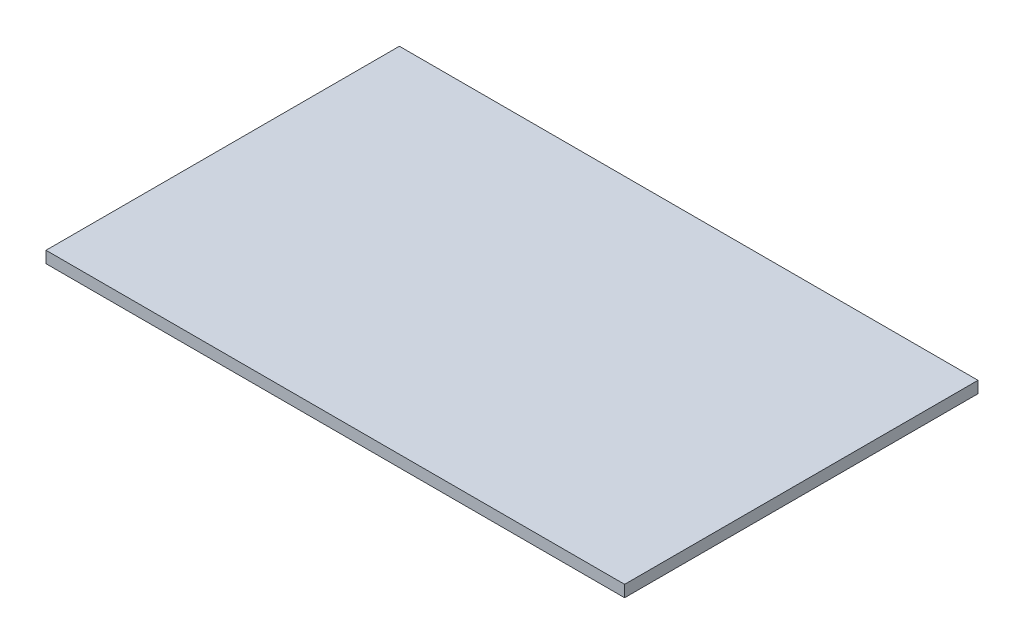
ISO-10303-21;
HEADER;
FILE_DESCRIPTION(('STEP AP214'),'2;1');
FILE_NAME('part.step','',(''),(''),'','','');
FILE_SCHEMA(('AUTOMOTIVE_DESIGN { 1 0 10303 214 1 1 1 1 }'));
ENDSEC;
DATA;
#1=APPLICATION_CONTEXT('core data for automotive mechanical design processes');
#2=APPLICATION_PROTOCOL_DEFINITION('international standard','automotive_design',2000,#1);
#3=PRODUCT_CONTEXT('',#1,'mechanical');
#4=PRODUCT('Part','Part','',(#3));
#5=PRODUCT_RELATED_PRODUCT_CATEGORY('part','',(#4));
#6=PRODUCT_DEFINITION_FORMATION('','',#4);
#7=PRODUCT_DEFINITION_CONTEXT('part definition',#1,'design');
#8=PRODUCT_DEFINITION('design','',#6,#7);
#9=PRODUCT_DEFINITION_SHAPE('','',#8);
#10=(LENGTH_UNIT() NAMED_UNIT(*) SI_UNIT(.MILLI.,.METRE.));
#11=(NAMED_UNIT(*) PLANE_ANGLE_UNIT() SI_UNIT($,.RADIAN.));
#12=(NAMED_UNIT(*) SI_UNIT($,.STERADIAN.) SOLID_ANGLE_UNIT());
#13=UNCERTAINTY_MEASURE_WITH_UNIT(LENGTH_MEASURE(1.E-05),#10,'distance_accuracy_value','');
#14=(GEOMETRIC_REPRESENTATION_CONTEXT(3) GLOBAL_UNCERTAINTY_ASSIGNED_CONTEXT((#13)) GLOBAL_UNIT_ASSIGNED_CONTEXT((#10,
#11,#12)) REPRESENTATION_CONTEXT('',''));
#15=CARTESIAN_POINT('',(0.,0.,0.));
#16=DIRECTION('',(0.,0.,1.));
#17=DIRECTION('',(1.,0.,0.));
#18=AXIS2_PLACEMENT_3D('',#15,#16,#17);
#19=CARTESIAN_POINT('',(0.,19.05,0.));
#20=DIRECTION('',(1.,0.,0.));
#21=DIRECTION('',(0.,0.,-1.));
#22=AXIS2_PLACEMENT_3D('',#19,#20,#21);
#23=PLANE('',#22);
#24=DIRECTION('',(0.,0.,1.));
#25=VECTOR('',#24,1.);
#26=CARTESIAN_POINT('',(0.,0.,0.));
#27=LINE('',#26,#25);
#28=CARTESIAN_POINT('',(0.,0.,-577.85));
#29=VERTEX_POINT('',#28);
#30=CARTESIAN_POINT('',(0.,0.,0.));
#31=VERTEX_POINT('',#30);
#32=EDGE_CURVE('E96',#29,#31,#27,.T.);
#33=ORIENTED_EDGE('',*,*,#32,.T.);
#34=DIRECTION('',(0.,-1.,0.));
#35=VECTOR('',#34,1.);
#36=CARTESIAN_POINT('',(0.,19.05,0.));
#37=LINE('',#36,#35);
#38=CARTESIAN_POINT('',(0.,19.05,0.));
#39=VERTEX_POINT('',#38);
#40=EDGE_CURVE('E11',#39,#31,#37,.T.);
#41=ORIENTED_EDGE('',*,*,#40,.F.);
#42=DIRECTION('',(0.,0.,1.));
#43=VECTOR('',#42,1.);
#44=CARTESIAN_POINT('',(0.,19.05,0.));
#45=LINE('',#44,#43);
#46=CARTESIAN_POINT('',(0.,19.05,-577.85));
#47=VERTEX_POINT('',#46);
#48=EDGE_CURVE('E84',#47,#39,#45,.T.);
#49=ORIENTED_EDGE('',*,*,#48,.F.);
#50=DIRECTION('',(0.,-1.,0.));
#51=VECTOR('',#50,1.);
#52=CARTESIAN_POINT('',(0.,19.05,-577.85));
#53=LINE('',#52,#51);
#54=EDGE_CURVE('E92',#47,#29,#53,.T.);
#55=ORIENTED_EDGE('',*,*,#54,.T.);
#56=EDGE_LOOP('',(#33,#41,#49,#55));
#57=FACE_BOUND('',#56,.T.);
#58=ADVANCED_FACE('F33',(#57),#23,.F.);
#59=CARTESIAN_POINT('',(0.,19.05,0.));
#60=DIRECTION('',(0.,0.,-1.));
#61=DIRECTION('',(-1.,0.,0.));
#62=AXIS2_PLACEMENT_3D('',#59,#60,#61);
#63=PLANE('',#62);
#64=DIRECTION('',(1.,0.,0.));
#65=VECTOR('',#64,1.);
#66=CARTESIAN_POINT('',(0.,0.,0.));
#67=LINE('',#66,#65);
#68=CARTESIAN_POINT('',(946.15,0.,0.));
#69=VERTEX_POINT('',#68);
#70=EDGE_CURVE('E88',#31,#69,#67,.T.);
#71=ORIENTED_EDGE('',*,*,#70,.T.);
#72=DIRECTION('',(0.,-1.,0.));
#73=VECTOR('',#72,1.);
#74=CARTESIAN_POINT('',(946.15,19.05,0.));
#75=LINE('',#74,#73);
#76=CARTESIAN_POINT('',(946.15,19.05,0.));
#77=VERTEX_POINT('',#76);
#78=EDGE_CURVE('E41',#77,#69,#75,.T.);
#79=ORIENTED_EDGE('',*,*,#78,.F.);
#80=DIRECTION('',(1.,0.,0.));
#81=VECTOR('',#80,1.);
#82=CARTESIAN_POINT('',(0.,19.05,0.));
#83=LINE('',#82,#81);
#84=EDGE_CURVE('E79',#39,#77,#83,.T.);
#85=ORIENTED_EDGE('',*,*,#84,.F.);
#86=ORIENTED_EDGE('',*,*,#40,.T.);
#87=EDGE_LOOP('',(#71,#79,#85,#86));
#88=FACE_BOUND('',#87,.T.);
#89=ADVANCED_FACE('F87',(#88),#63,.F.);
#90=CARTESIAN_POINT('',(946.15,19.05,0.));
#91=DIRECTION('',(-1.,0.,0.));
#92=DIRECTION('',(0.,0.,1.));
#93=AXIS2_PLACEMENT_3D('',#90,#91,#92);
#94=PLANE('',#93);
#95=DIRECTION('',(0.,0.,-1.));
#96=VECTOR('',#95,1.);
#97=CARTESIAN_POINT('',(946.15,0.,0.));
#98=LINE('',#97,#96);
#99=CARTESIAN_POINT('',(946.15,0.,-577.85));
#100=VERTEX_POINT('',#99);
#101=EDGE_CURVE('E66',#69,#100,#98,.T.);
#102=ORIENTED_EDGE('',*,*,#101,.T.);
#103=DIRECTION('',(0.,-1.,0.));
#104=VECTOR('',#103,1.);
#105=CARTESIAN_POINT('',(946.15,19.05,-577.85));
#106=LINE('',#105,#104);
#107=CARTESIAN_POINT('',(946.15,19.05,-577.85));
#108=VERTEX_POINT('',#107);
#109=EDGE_CURVE('E89',#108,#100,#106,.T.);
#110=ORIENTED_EDGE('',*,*,#109,.F.);
#111=DIRECTION('',(0.,0.,-1.));
#112=VECTOR('',#111,1.);
#113=CARTESIAN_POINT('',(946.15,19.05,0.));
#114=LINE('',#113,#112);
#115=EDGE_CURVE('E82',#77,#108,#114,.T.);
#116=ORIENTED_EDGE('',*,*,#115,.F.);
#117=ORIENTED_EDGE('',*,*,#78,.T.);
#118=EDGE_LOOP('',(#102,#110,#116,#117));
#119=FACE_BOUND('',#118,.T.);
#120=ADVANCED_FACE('F90',(#119),#94,.F.);
#121=CARTESIAN_POINT('',(0.,19.05,-577.85));
#122=DIRECTION('',(0.,0.,1.));
#123=DIRECTION('',(1.,0.,0.));
#124=AXIS2_PLACEMENT_3D('',#121,#122,#123);
#125=PLANE('',#124);
#126=DIRECTION('',(-1.,0.,0.));
#127=VECTOR('',#126,1.);
#128=CARTESIAN_POINT('',(0.,0.,-577.85));
#129=LINE('',#128,#127);
#130=EDGE_CURVE('E72',#100,#29,#129,.T.);
#131=ORIENTED_EDGE('',*,*,#130,.T.);
#132=ORIENTED_EDGE('',*,*,#54,.F.);
#133=DIRECTION('',(-1.,0.,0.));
#134=VECTOR('',#133,1.);
#135=CARTESIAN_POINT('',(0.,19.05,-577.85));
#136=LINE('',#135,#134);
#137=EDGE_CURVE('E49',#108,#47,#136,.T.);
#138=ORIENTED_EDGE('',*,*,#137,.F.);
#139=ORIENTED_EDGE('',*,*,#109,.T.);
#140=EDGE_LOOP('',(#131,#132,#138,#139));
#141=FACE_BOUND('',#140,.T.);
#142=ADVANCED_FACE('F103',(#141),#125,.F.);
#143=CARTESIAN_POINT('',(0.,19.05,0.));
#144=DIRECTION('',(0.,-1.,0.));
#145=DIRECTION('',(0.,0.,-1.));
#146=AXIS2_PLACEMENT_3D('',#143,#144,#145);
#147=PLANE('',#146);
#148=ORIENTED_EDGE('',*,*,#48,.T.);
#149=ORIENTED_EDGE('',*,*,#84,.T.);
#150=ORIENTED_EDGE('',*,*,#115,.T.);
#151=ORIENTED_EDGE('',*,*,#137,.T.);
#152=EDGE_LOOP('',(#148,#149,#150,#151));
#153=FACE_BOUND('',#152,.T.);
#154=ADVANCED_FACE('F80',(#153),#147,.F.);
#155=CARTESIAN_POINT('',(0.,0.,0.));
#156=DIRECTION('',(0.,-1.,0.));
#157=DIRECTION('',(0.,0.,-1.));
#158=AXIS2_PLACEMENT_3D('',#155,#156,#157);
#159=PLANE('',#158);
#160=ORIENTED_EDGE('',*,*,#32,.F.);
#161=ORIENTED_EDGE('',*,*,#130,.F.);
#162=ORIENTED_EDGE('',*,*,#101,.F.);
#163=ORIENTED_EDGE('',*,*,#70,.F.);
#164=EDGE_LOOP('',(#160,#161,#162,#163));
#165=FACE_BOUND('',#164,.T.);
#166=ADVANCED_FACE('F106',(#165),#159,.T.);
#167=CLOSED_SHELL('',(#58,#89,#120,#142,#154,#166));
#168=MANIFOLD_SOLID_BREP('B2',#167);
#169=ADVANCED_BREP_SHAPE_REPRESENTATION('',(#18,#168),#14);
#170=SHAPE_DEFINITION_REPRESENTATION(#9,#169);
ENDSEC;
END-ISO-10303-21;
